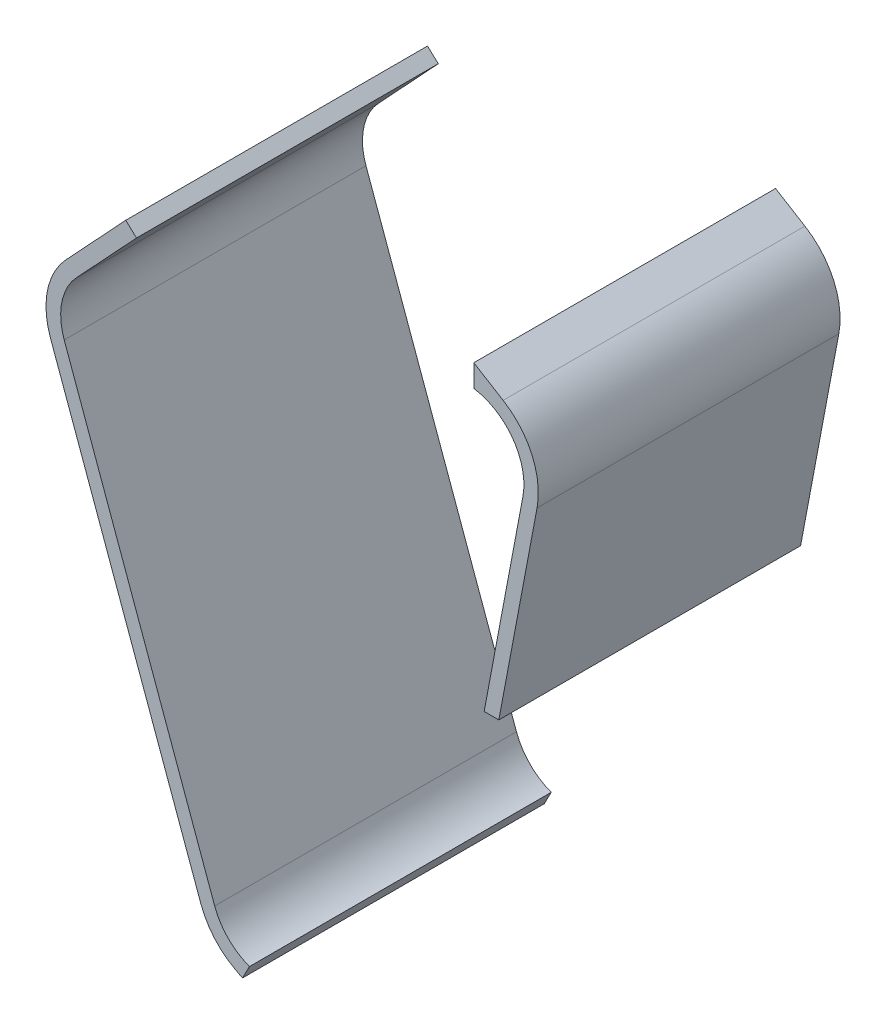
ISO-10303-21;
HEADER;
FILE_DESCRIPTION(('STEP AP214'),'2;1');
FILE_NAME('part.step','',(''),(''),'','','');
FILE_SCHEMA(('AUTOMOTIVE_DESIGN { 1 0 10303 214 1 1 1 1 }'));
ENDSEC;
DATA;
#1=APPLICATION_CONTEXT('core data for automotive mechanical design processes');
#2=APPLICATION_PROTOCOL_DEFINITION('international standard','automotive_design',2000,#1);
#3=PRODUCT_CONTEXT('',#1,'mechanical');
#4=PRODUCT('Part','Part','',(#3));
#5=PRODUCT_RELATED_PRODUCT_CATEGORY('part','',(#4));
#6=PRODUCT_DEFINITION_FORMATION('','',#4);
#7=PRODUCT_DEFINITION_CONTEXT('part definition',#1,'design');
#8=PRODUCT_DEFINITION('design','',#6,#7);
#9=PRODUCT_DEFINITION_SHAPE('','',#8);
#10=(LENGTH_UNIT() NAMED_UNIT(*) SI_UNIT(.MILLI.,.METRE.));
#11=(NAMED_UNIT(*) PLANE_ANGLE_UNIT() SI_UNIT($,.RADIAN.));
#12=(NAMED_UNIT(*) SI_UNIT($,.STERADIAN.) SOLID_ANGLE_UNIT());
#13=UNCERTAINTY_MEASURE_WITH_UNIT(LENGTH_MEASURE(1.E-05),#10,'distance_accuracy_value','');
#14=(GEOMETRIC_REPRESENTATION_CONTEXT(3) GLOBAL_UNCERTAINTY_ASSIGNED_CONTEXT((#13)) GLOBAL_UNIT_ASSIGNED_CONTEXT((#10,
#11,#12)) REPRESENTATION_CONTEXT('',''));
#15=CARTESIAN_POINT('',(0.,0.,0.));
#16=DIRECTION('',(0.,0.,1.));
#17=DIRECTION('',(1.,0.,0.));
#18=AXIS2_PLACEMENT_3D('',#15,#16,#17);
#19=CARTESIAN_POINT('',(1.00450592374361,185.32670057142,205.6));
#20=DIRECTION('',(-0.982679527718927,0.185313102078905,0.));
#21=DIRECTION('',(-0.185313102078905,-0.982679527718927,0.));
#22=AXIS2_PLACEMENT_3D('',#19,#20,#21);
#23=PLANE('',#22);
#24=DIRECTION('',(0.185313102078905,0.982679527718927,0.));
#25=VECTOR('',#24,1.);
#26=CARTESIAN_POINT('',(1.00450592374361,185.32670057142,0.));
#27=LINE('',#26,#25);
#28=CARTESIAN_POINT('',(1.00450592374361,185.32670057142,0.));
#29=VERTEX_POINT('',#28);
#30=CARTESIAN_POINT('',(27.0434246895327,323.406049025595,0.));
#31=VERTEX_POINT('',#30);
#32=EDGE_CURVE('E135',#29,#31,#27,.T.);
#33=ORIENTED_EDGE('',*,*,#32,.T.);
#34=DIRECTION('',(0.,0.,-1.));
#35=VECTOR('',#34,1.);
#36=CARTESIAN_POINT('',(27.0434246895327,323.406049025595,205.6));
#37=LINE('',#36,#35);
#38=CARTESIAN_POINT('',(27.0434246895327,323.406049025595,205.6));
#39=VERTEX_POINT('',#38);
#40=EDGE_CURVE('E12',#39,#31,#37,.T.);
#41=ORIENTED_EDGE('',*,*,#40,.F.);
#42=DIRECTION('',(0.185313102078905,0.982679527718927,0.));
#43=VECTOR('',#42,1.);
#44=CARTESIAN_POINT('',(1.00450592374361,185.32670057142,205.6));
#45=LINE('',#44,#43);
#46=CARTESIAN_POINT('',(1.00450592374361,185.32670057142,205.6));
#47=VERTEX_POINT('',#46);
#48=EDGE_CURVE('E147',#47,#39,#45,.T.);
#49=ORIENTED_EDGE('',*,*,#48,.F.);
#50=DIRECTION('',(0.,0.,-1.));
#51=VECTOR('',#50,1.);
#52=CARTESIAN_POINT('',(1.00450592374361,185.32670057142,205.6));
#53=LINE('',#52,#51);
#54=EDGE_CURVE('E131',#47,#29,#53,.T.);
#55=ORIENTED_EDGE('',*,*,#54,.T.);
#56=EDGE_LOOP('',(#33,#41,#49,#55));
#57=FACE_BOUND('',#56,.T.);
#58=ADVANCED_FACE('F45',(#57),#23,.F.);
#59=CARTESIAN_POINT('',(-22.0905516964136,332.67170412954,205.6));
#60=DIRECTION('',(0.,0.,-1.));
#61=DIRECTION('',(-1.,0.,0.));
#62=AXIS2_PLACEMENT_3D('',#59,#60,#61);
#63=CYLINDRICAL_SURFACE('',#62,50.);
#64=CARTESIAN_POINT('',(-22.0905516964136,332.67170412954,0.));
#65=DIRECTION('',(0.,0.,1.));
#66=DIRECTION('',(1.,0.,0.));
#67=AXIS2_PLACEMENT_3D('',#64,#65,#66);
#68=CIRCLE('',#67,50.);
#69=CARTESIAN_POINT('',(3.93982224508008,375.361511255668,0.));
#70=VERTEX_POINT('',#69);
#71=EDGE_CURVE('E138',#31,#70,#68,.T.);
#72=ORIENTED_EDGE('',*,*,#71,.T.);
#73=DIRECTION('',(0.,0.,-1.));
#74=VECTOR('',#73,1.);
#75=CARTESIAN_POINT('',(3.93982224508008,375.361511255668,205.6));
#76=LINE('',#75,#74);
#77=CARTESIAN_POINT('',(3.93982224508008,375.361511255668,205.6));
#78=VERTEX_POINT('',#77);
#79=EDGE_CURVE('E53',#78,#70,#76,.T.);
#80=ORIENTED_EDGE('',*,*,#79,.F.);
#81=CARTESIAN_POINT('',(-22.0905516964136,332.67170412954,205.6));
#82=DIRECTION('',(0.,0.,1.));
#83=DIRECTION('',(1.,0.,0.));
#84=AXIS2_PLACEMENT_3D('',#81,#82,#83);
#85=CIRCLE('',#84,50.);
#86=EDGE_CURVE('E101',#39,#78,#85,.T.);
#87=ORIENTED_EDGE('',*,*,#86,.F.);
#88=ORIENTED_EDGE('',*,*,#40,.T.);
#89=EDGE_LOOP('',(#72,#80,#87,#88));
#90=FACE_BOUND('',#89,.T.);
#91=ADVANCED_FACE('F172',(#90),#63,.T.);
#92=CARTESIAN_POINT('',(3.93982224508008,375.361511255668,205.6));
#93=DIRECTION('',(-0.520607478829875,-0.853796142522558,0.));
#94=DIRECTION('',(0.853796142522558,-0.520607478829876,0.));
#95=AXIS2_PLACEMENT_3D('',#92,#93,#94);
#96=PLANE('',#95);
#97=DIRECTION('',(-0.853796142522558,0.520607478829876,0.));
#98=VECTOR('',#97,1.);
#99=CARTESIAN_POINT('',(3.93982224508008,375.361511255668,0.));
#100=LINE('',#99,#98);
#101=CARTESIAN_POINT('',(-16.0601777549199,387.556634960297,0.));
#102=VERTEX_POINT('',#101);
#103=EDGE_CURVE('E140',#70,#102,#100,.T.);
#104=ORIENTED_EDGE('',*,*,#103,.T.);
#105=DIRECTION('',(0.,0.,-1.));
#106=VECTOR('',#105,1.);
#107=CARTESIAN_POINT('',(-16.0601777549199,387.556634960297,205.6));
#108=LINE('',#107,#106);
#109=CARTESIAN_POINT('',(-16.0601777549199,387.556634960297,205.6));
#110=VERTEX_POINT('',#109);
#111=EDGE_CURVE('E151',#110,#102,#108,.T.);
#112=ORIENTED_EDGE('',*,*,#111,.F.);
#113=DIRECTION('',(-0.853796142522558,0.520607478829876,0.));
#114=VECTOR('',#113,1.);
#115=CARTESIAN_POINT('',(3.93982224508008,375.361511255668,205.6));
#116=LINE('',#115,#114);
#117=EDGE_CURVE('E159',#78,#110,#116,.T.);
#118=ORIENTED_EDGE('',*,*,#117,.F.);
#119=ORIENTED_EDGE('',*,*,#79,.T.);
#120=EDGE_LOOP('',(#104,#112,#118,#119));
#121=FACE_BOUND('',#120,.T.);
#122=ADVANCED_FACE('F157',(#121),#96,.F.);
#123=CARTESIAN_POINT('',(-16.0601777549199,372.389722305509,205.6));
#124=DIRECTION('',(1.,0.,0.));
#125=DIRECTION('',(0.,1.,0.));
#126=AXIS2_PLACEMENT_3D('',#123,#124,#125);
#127=PLANE('',#126);
#128=DIRECTION('',(0.,-1.,0.));
#129=VECTOR('',#128,1.);
#130=CARTESIAN_POINT('',(-16.0601777549199,372.389722305509,0.));
#131=LINE('',#130,#129);
#132=CARTESIAN_POINT('',(-16.0601777549199,372.389722305509,0.));
#133=VERTEX_POINT('',#132);
#134=EDGE_CURVE('E142',#102,#133,#131,.T.);
#135=ORIENTED_EDGE('',*,*,#134,.T.);
#136=DIRECTION('',(0.,0.,-1.));
#137=VECTOR('',#136,1.);
#138=CARTESIAN_POINT('',(-16.0601777549199,372.389722305509,205.6));
#139=LINE('',#138,#137);
#140=CARTESIAN_POINT('',(-16.0601777549199,372.389722305509,205.6));
#141=VERTEX_POINT('',#140);
#142=EDGE_CURVE('E126',#141,#133,#139,.T.);
#143=ORIENTED_EDGE('',*,*,#142,.F.);
#144=DIRECTION('',(0.,-1.,0.));
#145=VECTOR('',#144,1.);
#146=CARTESIAN_POINT('',(-16.0601777549199,372.389722305509,205.6));
#147=LINE('',#146,#145);
#148=EDGE_CURVE('E117',#110,#141,#147,.T.);
#149=ORIENTED_EDGE('',*,*,#148,.F.);
#150=ORIENTED_EDGE('',*,*,#111,.T.);
#151=EDGE_LOOP('',(#135,#143,#149,#150));
#152=FACE_BOUND('',#151,.T.);
#153=ADVANCED_FACE('F165',(#152),#127,.F.);
#154=CARTESIAN_POINT('',(-22.0905516964136,332.67170412954,205.6));
#155=DIRECTION('',(0.,0.,-1.));
#156=DIRECTION('',(-1.,0.,0.));
#157=AXIS2_PLACEMENT_3D('',#154,#155,#156);
#158=CYLINDRICAL_SURFACE('',#157,40.1732047228107);
#159=CARTESIAN_POINT('',(-22.0905516964136,332.67170412954,0.));
#160=DIRECTION('',(0.,0.,-1.));
#161=DIRECTION('',(1.,0.,0.));
#162=AXIS2_PLACEMENT_3D('',#159,#160,#161);
#163=CIRCLE('',#162,40.1732047228107);
#164=CARTESIAN_POINT('',(17.3868341475538,325.227082941905,0.));
#165=VERTEX_POINT('',#164);
#166=EDGE_CURVE('E125',#133,#165,#163,.T.);
#167=ORIENTED_EDGE('',*,*,#166,.T.);
#168=DIRECTION('',(0.,0.,-1.));
#169=VECTOR('',#168,1.);
#170=CARTESIAN_POINT('',(17.3868341475538,325.227082941905,205.6));
#171=LINE('',#170,#169);
#172=CARTESIAN_POINT('',(17.3868341475538,325.227082941905,205.6));
#173=VERTEX_POINT('',#172);
#174=EDGE_CURVE('E122',#173,#165,#171,.T.);
#175=ORIENTED_EDGE('',*,*,#174,.F.);
#176=CARTESIAN_POINT('',(-22.0905516964136,332.67170412954,205.6));
#177=DIRECTION('',(0.,0.,-1.));
#178=DIRECTION('',(1.,0.,0.));
#179=AXIS2_PLACEMENT_3D('',#176,#177,#178);
#180=CIRCLE('',#179,40.1732047228107);
#181=EDGE_CURVE('E111',#141,#173,#180,.T.);
#182=ORIENTED_EDGE('',*,*,#181,.F.);
#183=ORIENTED_EDGE('',*,*,#142,.T.);
#184=EDGE_LOOP('',(#167,#175,#182,#183));
#185=FACE_BOUND('',#184,.T.);
#186=ADVANCED_FACE('F123',(#185),#158,.F.);
#187=CARTESIAN_POINT('',(-8.99549407625641,185.32670057142,205.6));
#188=DIRECTION('',(0.982679527718927,-0.185313102078906,0.));
#189=DIRECTION('',(0.185313102078906,0.982679527718927,0.));
#190=AXIS2_PLACEMENT_3D('',#187,#188,#189);
#191=PLANE('',#190);
#192=DIRECTION('',(-0.185313102078906,-0.982679527718927,0.));
#193=VECTOR('',#192,1.);
#194=CARTESIAN_POINT('',(-8.99549407625641,185.32670057142,0.));
#195=LINE('',#194,#193);
#196=CARTESIAN_POINT('',(-8.99549407625641,185.32670057142,0.));
#197=VERTEX_POINT('',#196);
#198=EDGE_CURVE('E87',#165,#197,#195,.T.);
#199=ORIENTED_EDGE('',*,*,#198,.T.);
#200=DIRECTION('',(0.,0.,-1.));
#201=VECTOR('',#200,1.);
#202=CARTESIAN_POINT('',(-8.99549407625641,185.32670057142,205.6));
#203=LINE('',#202,#201);
#204=CARTESIAN_POINT('',(-8.99549407625641,185.32670057142,205.6));
#205=VERTEX_POINT('',#204);
#206=EDGE_CURVE('E127',#205,#197,#203,.T.);
#207=ORIENTED_EDGE('',*,*,#206,.F.);
#208=DIRECTION('',(-0.185313102078906,-0.982679527718927,0.));
#209=VECTOR('',#208,1.);
#210=CARTESIAN_POINT('',(-8.99549407625641,185.32670057142,205.6));
#211=LINE('',#210,#209);
#212=EDGE_CURVE('E115',#173,#205,#211,.T.);
#213=ORIENTED_EDGE('',*,*,#212,.F.);
#214=ORIENTED_EDGE('',*,*,#174,.T.);
#215=EDGE_LOOP('',(#199,#207,#213,#214));
#216=FACE_BOUND('',#215,.T.);
#217=ADVANCED_FACE('F129',(#216),#191,.F.);
#218=CARTESIAN_POINT('',(-8.99549407625641,185.32670057142,205.6));
#219=DIRECTION('',(0.,1.,0.));
#220=DIRECTION('',(0.,0.,1.));
#221=AXIS2_PLACEMENT_3D('',#218,#219,#220);
#222=PLANE('',#221);
#223=DIRECTION('',(1.,0.,0.));
#224=VECTOR('',#223,1.);
#225=CARTESIAN_POINT('',(-8.99549407625641,185.32670057142,0.));
#226=LINE('',#225,#224);
#227=EDGE_CURVE('E93',#197,#29,#226,.T.);
#228=ORIENTED_EDGE('',*,*,#227,.T.);
#229=ORIENTED_EDGE('',*,*,#54,.F.);
#230=DIRECTION('',(1.,0.,0.));
#231=VECTOR('',#230,1.);
#232=CARTESIAN_POINT('',(-8.99549407625641,185.32670057142,205.6));
#233=LINE('',#232,#231);
#234=EDGE_CURVE('E61',#205,#47,#233,.T.);
#235=ORIENTED_EDGE('',*,*,#234,.F.);
#236=ORIENTED_EDGE('',*,*,#206,.T.);
#237=EDGE_LOOP('',(#228,#229,#235,#236));
#238=FACE_BOUND('',#237,.T.);
#239=ADVANCED_FACE('F186',(#238),#222,.F.);
#240=CARTESIAN_POINT('',(-22.0905516964136,332.67170412954,205.6));
#241=DIRECTION('',(0.,0.,1.));
#242=DIRECTION('',(1.,0.,0.));
#243=AXIS2_PLACEMENT_3D('',#240,#241,#242);
#244=PLANE('',#243);
#245=ORIENTED_EDGE('',*,*,#48,.T.);
#246=ORIENTED_EDGE('',*,*,#86,.T.);
#247=ORIENTED_EDGE('',*,*,#117,.T.);
#248=ORIENTED_EDGE('',*,*,#148,.T.);
#249=ORIENTED_EDGE('',*,*,#181,.T.);
#250=ORIENTED_EDGE('',*,*,#212,.T.);
#251=ORIENTED_EDGE('',*,*,#234,.T.);
#252=EDGE_LOOP('',(#245,#246,#247,#248,#249,#250,#251));
#253=FACE_BOUND('',#252,.T.);
#254=ADVANCED_FACE('F113',(#253),#244,.T.);
#255=CARTESIAN_POINT('',(-22.0905516964136,332.67170412954,0.));
#256=DIRECTION('',(0.,0.,1.));
#257=DIRECTION('',(1.,0.,0.));
#258=AXIS2_PLACEMENT_3D('',#255,#256,#257);
#259=PLANE('',#258);
#260=ORIENTED_EDGE('',*,*,#32,.F.);
#261=ORIENTED_EDGE('',*,*,#227,.F.);
#262=ORIENTED_EDGE('',*,*,#198,.F.);
#263=ORIENTED_EDGE('',*,*,#166,.F.);
#264=ORIENTED_EDGE('',*,*,#134,.F.);
#265=ORIENTED_EDGE('',*,*,#103,.F.);
#266=ORIENTED_EDGE('',*,*,#71,.F.);
#267=EDGE_LOOP('',(#260,#261,#262,#263,#264,#265,#266));
#268=FACE_BOUND('',#267,.T.);
#269=ADVANCED_FACE('F163',(#268),#259,.F.);
#270=CLOSED_SHELL('',(#58,#91,#122,#153,#186,#217,#239,#254,#269));
#271=MANIFOLD_SOLID_BREP('B2',#270);
#272=CARTESIAN_POINT('',(-178.073768212147,-51.9566293360056,205.6));
#273=DIRECTION('',(0.461604802751188,0.887085681361748,0.));
#274=DIRECTION('',(-0.887085681361748,0.461604802751188,0.));
#275=AXIS2_PLACEMENT_3D('',#272,#273,#274);
#276=PLANE('',#275);
#277=DIRECTION('',(0.887085681361748,-0.461604802751187,0.));
#278=VECTOR('',#277,1.);
#279=CARTESIAN_POINT('',(-178.073768212147,-51.9566293360056,0.));
#280=LINE('',#279,#278);
#281=CARTESIAN_POINT('',(-178.073768212147,-51.9566293360056,0.));
#282=VERTEX_POINT('',#281);
#283=CARTESIAN_POINT('',(-173.638339805338,-54.2646533497616,0.));
#284=VERTEX_POINT('',#283);
#285=EDGE_CURVE('E361',#282,#284,#280,.T.);
#286=ORIENTED_EDGE('',*,*,#285,.T.);
#287=DIRECTION('',(0.,0.,-1.));
#288=VECTOR('',#287,1.);
#289=CARTESIAN_POINT('',(-173.638339805338,-54.2646533497616,205.6));
#290=LINE('',#289,#288);
#291=CARTESIAN_POINT('',(-173.638339805338,-54.2646533497616,205.6));
#292=VERTEX_POINT('',#291);
#293=EDGE_CURVE('E43',#292,#284,#290,.T.);
#294=ORIENTED_EDGE('',*,*,#293,.F.);
#295=DIRECTION('',(0.887085681361748,-0.461604802751187,0.));
#296=VECTOR('',#295,1.);
#297=CARTESIAN_POINT('',(-178.073768212147,-51.9566293360056,205.6));
#298=LINE('',#297,#296);
#299=CARTESIAN_POINT('',(-178.073768212147,-51.9566293360056,205.6));
#300=VERTEX_POINT('',#299);
#301=EDGE_CURVE('E381',#300,#292,#298,.T.);
#302=ORIENTED_EDGE('',*,*,#301,.F.);
#303=DIRECTION('',(0.,0.,-1.));
#304=VECTOR('',#303,1.);
#305=CARTESIAN_POINT('',(-178.073768212147,-51.9566293360056,205.6));
#306=LINE('',#305,#304);
#307=EDGE_CURVE('E357',#300,#282,#306,.T.);
#308=ORIENTED_EDGE('',*,*,#307,.T.);
#309=EDGE_LOOP('',(#286,#294,#302,#308));
#310=FACE_BOUND('',#309,.T.);
#311=ADVANCED_FACE('F247',(#310),#276,.F.);
#312=CARTESIAN_POINT('',(-173.638339805338,-54.2646533497616,205.6));
#313=DIRECTION('',(-0.887085681361748,0.461604802751187,0.));
#314=DIRECTION('',(-0.461604802751188,-0.887085681361748,0.));
#315=AXIS2_PLACEMENT_3D('',#312,#313,#314);
#316=PLANE('',#315);
#317=DIRECTION('',(0.461604802751187,0.887085681361748,0.));
#318=VECTOR('',#317,1.);
#319=CARTESIAN_POINT('',(-173.638339805338,-54.2646533497616,0.));
#320=LINE('',#319,#318);
#321=CARTESIAN_POINT('',(-168.877472348868,-45.1154908490162,0.));
#322=VERTEX_POINT('',#321);
#323=EDGE_CURVE('E364',#284,#322,#320,.T.);
#324=ORIENTED_EDGE('',*,*,#323,.T.);
#325=DIRECTION('',(0.,0.,-1.));
#326=VECTOR('',#325,1.);
#327=CARTESIAN_POINT('',(-168.877472348868,-45.1154908490162,205.6));
#328=LINE('',#327,#326);
#329=CARTESIAN_POINT('',(-168.877472348868,-45.1154908490162,205.6));
#330=VERTEX_POINT('',#329);
#331=EDGE_CURVE('E255',#330,#322,#328,.T.);
#332=ORIENTED_EDGE('',*,*,#331,.F.);
#333=DIRECTION('',(0.461604802751187,0.887085681361748,0.));
#334=VECTOR('',#333,1.);
#335=CARTESIAN_POINT('',(-173.638339805338,-54.2646533497616,205.6));
#336=LINE('',#335,#334);
#337=EDGE_CURVE('E315',#292,#330,#336,.T.);
#338=ORIENTED_EDGE('',*,*,#337,.F.);
#339=ORIENTED_EDGE('',*,*,#293,.T.);
#340=EDGE_LOOP('',(#324,#332,#338,#339));
#341=FACE_BOUND('',#340,.T.);
#342=ADVANCED_FACE('F453',(#341),#316,.F.);
#343=CARTESIAN_POINT('',(-154.993528074587,-7.6023452679182,205.6));
#344=DIRECTION('',(0.,0.,-1.));
#345=DIRECTION('',(-1.,0.,0.));
#346=AXIS2_PLACEMENT_3D('',#343,#344,#345);
#347=CYLINDRICAL_SURFACE('',#346,40.);
#348=CARTESIAN_POINT('',(-154.993528074587,-7.6023452679182,0.));
#349=DIRECTION('',(0.,0.,-1.));
#350=DIRECTION('',(1.,0.,0.));
#351=AXIS2_PLACEMENT_3D('',#348,#349,#350);
#352=CIRCLE('',#351,40.);
#353=CARTESIAN_POINT('',(-192.597121358955,-21.2394187114352,0.));
#354=VERTEX_POINT('',#353);
#355=EDGE_CURVE('E366',#322,#354,#352,.T.);
#356=ORIENTED_EDGE('',*,*,#355,.T.);
#357=DIRECTION('',(0.,0.,-1.));
#358=VECTOR('',#357,1.);
#359=CARTESIAN_POINT('',(-192.597121358955,-21.2394187114352,205.6));
#360=LINE('',#359,#358);
#361=CARTESIAN_POINT('',(-192.597121358955,-21.2394187114352,205.6));
#362=VERTEX_POINT('',#361);
#363=EDGE_CURVE('E397',#362,#354,#360,.T.);
#364=ORIENTED_EDGE('',*,*,#363,.F.);
#365=CARTESIAN_POINT('',(-154.993528074587,-7.6023452679182,205.6));
#366=DIRECTION('',(0.,0.,-1.));
#367=DIRECTION('',(1.,0.,0.));
#368=AXIS2_PLACEMENT_3D('',#365,#366,#367);
#369=CIRCLE('',#368,40.);
#370=EDGE_CURVE('E405',#330,#362,#369,.T.);
#371=ORIENTED_EDGE('',*,*,#370,.F.);
#372=ORIENTED_EDGE('',*,*,#331,.T.);
#373=EDGE_LOOP('',(#356,#364,#371,#372));
#374=FACE_BOUND('',#373,.T.);
#375=ADVANCED_FACE('F403',(#374),#347,.F.);
#376=CARTESIAN_POINT('',(-192.597121358955,-21.2394187114352,205.6));
#377=DIRECTION('',(-0.940089832109185,-0.340926836087926,0.));
#378=DIRECTION('',(0.340926836087926,-0.940089832109185,0.));
#379=AXIS2_PLACEMENT_3D('',#376,#377,#378);
#380=PLANE('',#379);
#381=DIRECTION('',(-0.340926836087926,0.940089832109185,0.));
#382=VECTOR('',#381,1.);
#383=CARTESIAN_POINT('',(-192.597121358955,-21.2394187114352,0.));
#384=LINE('',#383,#382);
#385=CARTESIAN_POINT('',(-295.118607687298,261.45879295161,0.));
#386=VERTEX_POINT('',#385);
#387=EDGE_CURVE('E368',#354,#386,#384,.T.);
#388=ORIENTED_EDGE('',*,*,#387,.T.);
#389=DIRECTION('',(0.,0.,-1.));
#390=VECTOR('',#389,1.);
#391=CARTESIAN_POINT('',(-295.118607687298,261.45879295161,205.6));
#392=LINE('',#391,#390);
#393=CARTESIAN_POINT('',(-295.118607687298,261.45879295161,205.6));
#394=VERTEX_POINT('',#393);
#395=EDGE_CURVE('E394',#394,#386,#392,.T.);
#396=ORIENTED_EDGE('',*,*,#395,.F.);
#397=DIRECTION('',(-0.340926836087926,0.940089832109185,0.));
#398=VECTOR('',#397,1.);
#399=CARTESIAN_POINT('',(-192.597121358955,-21.2394187114352,205.6));
#400=LINE('',#399,#398);
#401=EDGE_CURVE('E423',#362,#394,#400,.T.);
#402=ORIENTED_EDGE('',*,*,#401,.F.);
#403=ORIENTED_EDGE('',*,*,#363,.T.);
#404=EDGE_LOOP('',(#388,#396,#402,#403));
#405=FACE_BOUND('',#404,.T.);
#406=ADVANCED_FACE('F414',(#405),#380,.F.);
#407=CARTESIAN_POINT('',(-257.515014402931,275.095866395127,205.6));
#408=DIRECTION('',(0.,0.,-1.));
#409=DIRECTION('',(-1.,0.,0.));
#410=AXIS2_PLACEMENT_3D('',#407,#408,#409);
#411=CYLINDRICAL_SURFACE('',#410,40.);
#412=CARTESIAN_POINT('',(-257.515014402931,275.095866395127,0.));
#413=DIRECTION('',(0.,0.,-1.));
#414=DIRECTION('',(1.,0.,0.));
#415=AXIS2_PLACEMENT_3D('',#412,#413,#414);
#416=CIRCLE('',#415,40.);
#417=CARTESIAN_POINT('',(-286.77014101567,302.374751395665,0.));
#418=VERTEX_POINT('',#417);
#419=EDGE_CURVE('E370',#386,#418,#416,.T.);
#420=ORIENTED_EDGE('',*,*,#419,.T.);
#421=DIRECTION('',(0.,0.,-1.));
#422=VECTOR('',#421,1.);
#423=CARTESIAN_POINT('',(-286.77014101567,302.374751395665,205.6));
#424=LINE('',#423,#422);
#425=CARTESIAN_POINT('',(-286.77014101567,302.374751395665,205.6));
#426=VERTEX_POINT('',#425);
#427=EDGE_CURVE('E391',#426,#418,#424,.T.);
#428=ORIENTED_EDGE('',*,*,#427,.F.);
#429=CARTESIAN_POINT('',(-257.515014402931,275.095866395127,205.6));
#430=DIRECTION('',(0.,0.,-1.));
#431=DIRECTION('',(1.,0.,0.));
#432=AXIS2_PLACEMENT_3D('',#429,#430,#431);
#433=CIRCLE('',#432,40.);
#434=EDGE_CURVE('E420',#394,#426,#433,.T.);
#435=ORIENTED_EDGE('',*,*,#434,.F.);
#436=ORIENTED_EDGE('',*,*,#395,.T.);
#437=EDGE_LOOP('',(#420,#428,#435,#436));
#438=FACE_BOUND('',#437,.T.);
#439=ADVANCED_FACE('F418',(#438),#411,.F.);
#440=CARTESIAN_POINT('',(-286.77014101567,302.374751395665,205.6));
#441=DIRECTION('',(-0.731378165318474,0.681972125013466,0.));
#442=DIRECTION('',(-0.681972125013466,-0.731378165318474,0.));
#443=AXIS2_PLACEMENT_3D('',#440,#441,#442);
#444=PLANE('',#443);
#445=DIRECTION('',(0.681972125013466,0.731378165318474,0.));
#446=VECTOR('',#445,1.);
#447=CARTESIAN_POINT('',(-286.77014101567,302.374751395665,0.));
#448=LINE('',#447,#446);
#449=CARTESIAN_POINT('',(-245.851813514862,346.257441314774,0.));
#450=VERTEX_POINT('',#449);
#451=EDGE_CURVE('E372',#418,#450,#448,.T.);
#452=ORIENTED_EDGE('',*,*,#451,.T.);
#453=DIRECTION('',(0.,0.,-1.));
#454=VECTOR('',#453,1.);
#455=CARTESIAN_POINT('',(-245.851813514862,346.257441314774,205.6));
#456=LINE('',#455,#454);
#457=CARTESIAN_POINT('',(-245.851813514862,346.257441314774,205.6));
#458=VERTEX_POINT('',#457);
#459=EDGE_CURVE('E388',#458,#450,#456,.T.);
#460=ORIENTED_EDGE('',*,*,#459,.F.);
#461=DIRECTION('',(0.681972125013466,0.731378165318474,0.));
#462=VECTOR('',#461,1.);
#463=CARTESIAN_POINT('',(-286.77014101567,302.374751395665,205.6));
#464=LINE('',#463,#462);
#465=EDGE_CURVE('E422',#426,#458,#464,.T.);
#466=ORIENTED_EDGE('',*,*,#465,.F.);
#467=ORIENTED_EDGE('',*,*,#427,.T.);
#468=EDGE_LOOP('',(#452,#460,#466,#467));
#469=FACE_BOUND('',#468,.T.);
#470=ADVANCED_FACE('F466',(#469),#444,.F.);
#471=CARTESIAN_POINT('',(-245.851813514862,346.257441314774,205.6));
#472=DIRECTION('',(-0.681972125013464,-0.731378165318476,0.));
#473=DIRECTION('',(0.731378165318476,-0.681972125013465,0.));
#474=AXIS2_PLACEMENT_3D('',#471,#472,#473);
#475=PLANE('',#474);
#476=DIRECTION('',(-0.731378165318476,0.681972125013464,0.));
#477=VECTOR('',#476,1.);
#478=CARTESIAN_POINT('',(-245.851813514862,346.257441314774,0.));
#479=LINE('',#478,#477);
#480=CARTESIAN_POINT('',(-253.165595168047,353.077162564908,0.));
#481=VERTEX_POINT('',#480);
#482=EDGE_CURVE('E374',#450,#481,#479,.T.);
#483=ORIENTED_EDGE('',*,*,#482,.T.);
#484=DIRECTION('',(0.,0.,-1.));
#485=VECTOR('',#484,1.);
#486=CARTESIAN_POINT('',(-253.165595168047,353.077162564908,205.6));
#487=LINE('',#486,#485);
#488=CARTESIAN_POINT('',(-253.165595168047,353.077162564908,205.6));
#489=VERTEX_POINT('',#488);
#490=EDGE_CURVE('E385',#489,#481,#487,.T.);
#491=ORIENTED_EDGE('',*,*,#490,.F.);
#492=DIRECTION('',(-0.731378165318476,0.681972125013464,0.));
#493=VECTOR('',#492,1.);
#494=CARTESIAN_POINT('',(-245.851813514862,346.257441314774,205.6));
#495=LINE('',#494,#493);
#496=EDGE_CURVE('E425',#458,#489,#495,.T.);
#497=ORIENTED_EDGE('',*,*,#496,.F.);
#498=ORIENTED_EDGE('',*,*,#459,.T.);
#499=EDGE_LOOP('',(#483,#491,#497,#498));
#500=FACE_BOUND('',#499,.T.);
#501=ADVANCED_FACE('F434',(#500),#475,.F.);
#502=CARTESIAN_POINT('',(-253.165595168047,353.077162564908,205.6));
#503=DIRECTION('',(0.731378165318474,-0.681972125013466,0.));
#504=DIRECTION('',(0.681972125013466,0.731378165318474,0.));
#505=AXIS2_PLACEMENT_3D('',#502,#503,#504);
#506=PLANE('',#505);
#507=DIRECTION('',(-0.681972125013466,-0.731378165318474,0.));
#508=VECTOR('',#507,1.);
#509=CARTESIAN_POINT('',(-253.165595168047,353.077162564908,0.));
#510=LINE('',#509,#508);
#511=CARTESIAN_POINT('',(-294.083922668855,309.1944726458,0.));
#512=VERTEX_POINT('',#511);
#513=EDGE_CURVE('E376',#481,#512,#510,.T.);
#514=ORIENTED_EDGE('',*,*,#513,.T.);
#515=DIRECTION('',(0.,0.,-1.));
#516=VECTOR('',#515,1.);
#517=CARTESIAN_POINT('',(-294.083922668855,309.1944726458,205.6));
#518=LINE('',#517,#516);
#519=CARTESIAN_POINT('',(-294.083922668855,309.1944726458,205.6));
#520=VERTEX_POINT('',#519);
#521=EDGE_CURVE('E352',#520,#512,#518,.T.);
#522=ORIENTED_EDGE('',*,*,#521,.F.);
#523=DIRECTION('',(-0.681972125013466,-0.731378165318474,0.));
#524=VECTOR('',#523,1.);
#525=CARTESIAN_POINT('',(-253.165595168047,353.077162564908,205.6));
#526=LINE('',#525,#524);
#527=EDGE_CURVE('E343',#489,#520,#526,.T.);
#528=ORIENTED_EDGE('',*,*,#527,.F.);
#529=ORIENTED_EDGE('',*,*,#490,.T.);
#530=EDGE_LOOP('',(#514,#522,#528,#529));
#531=FACE_BOUND('',#530,.T.);
#532=ADVANCED_FACE('F438',(#531),#506,.F.);
#533=CARTESIAN_POINT('',(-257.515014402931,275.095866395127,205.6));
#534=DIRECTION('',(0.,0.,-1.));
#535=DIRECTION('',(-1.,0.,0.));
#536=AXIS2_PLACEMENT_3D('',#533,#534,#535);
#537=CYLINDRICAL_SURFACE('',#536,50.);
#538=CARTESIAN_POINT('',(-257.515014402931,275.095866395127,0.));
#539=DIRECTION('',(0.,0.,1.));
#540=DIRECTION('',(1.,0.,0.));
#541=AXIS2_PLACEMENT_3D('',#538,#539,#540);
#542=CIRCLE('',#541,50.);
#543=CARTESIAN_POINT('',(-304.51950600839,258.04952459073,0.));
#544=VERTEX_POINT('',#543);
#545=EDGE_CURVE('E351',#512,#544,#542,.T.);
#546=ORIENTED_EDGE('',*,*,#545,.T.);
#547=DIRECTION('',(0.,0.,-1.));
#548=VECTOR('',#547,1.);
#549=CARTESIAN_POINT('',(-304.51950600839,258.04952459073,205.6));
#550=LINE('',#549,#548);
#551=CARTESIAN_POINT('',(-304.51950600839,258.04952459073,205.6));
#552=VERTEX_POINT('',#551);
#553=EDGE_CURVE('E348',#552,#544,#550,.T.);
#554=ORIENTED_EDGE('',*,*,#553,.F.);
#555=CARTESIAN_POINT('',(-257.515014402931,275.095866395127,205.6));
#556=DIRECTION('',(0.,0.,1.));
#557=DIRECTION('',(1.,0.,0.));
#558=AXIS2_PLACEMENT_3D('',#555,#556,#557);
#559=CIRCLE('',#558,50.);
#560=EDGE_CURVE('E337',#520,#552,#559,.T.);
#561=ORIENTED_EDGE('',*,*,#560,.F.);
#562=ORIENTED_EDGE('',*,*,#521,.T.);
#563=EDGE_LOOP('',(#546,#554,#561,#562));
#564=FACE_BOUND('',#563,.T.);
#565=ADVANCED_FACE('F349',(#564),#537,.T.);
#566=CARTESIAN_POINT('',(-304.51950600839,258.04952459073,205.6));
#567=DIRECTION('',(0.940089832109185,0.340926836087926,0.));
#568=DIRECTION('',(-0.340926836087926,0.940089832109186,0.));
#569=AXIS2_PLACEMENT_3D('',#566,#567,#568);
#570=PLANE('',#569);
#571=DIRECTION('',(0.340926836087926,-0.940089832109185,0.));
#572=VECTOR('',#571,1.);
#573=CARTESIAN_POINT('',(-304.51950600839,258.04952459073,0.));
#574=LINE('',#573,#572);
#575=CARTESIAN_POINT('',(-201.998019680047,-24.6486870723146,0.));
#576=VERTEX_POINT('',#575);
#577=EDGE_CURVE('E301',#544,#576,#574,.T.);
#578=ORIENTED_EDGE('',*,*,#577,.T.);
#579=DIRECTION('',(0.,0.,-1.));
#580=VECTOR('',#579,1.);
#581=CARTESIAN_POINT('',(-201.998019680047,-24.6486870723146,205.6));
#582=LINE('',#581,#580);
#583=CARTESIAN_POINT('',(-201.998019680047,-24.6486870723146,205.6));
#584=VERTEX_POINT('',#583);
#585=EDGE_CURVE('E353',#584,#576,#582,.T.);
#586=ORIENTED_EDGE('',*,*,#585,.F.);
#587=DIRECTION('',(0.340926836087926,-0.940089832109185,0.));
#588=VECTOR('',#587,1.);
#589=CARTESIAN_POINT('',(-304.51950600839,258.04952459073,205.6));
#590=LINE('',#589,#588);
#591=EDGE_CURVE('E341',#552,#584,#590,.T.);
#592=ORIENTED_EDGE('',*,*,#591,.F.);
#593=ORIENTED_EDGE('',*,*,#553,.T.);
#594=EDGE_LOOP('',(#578,#586,#592,#593));
#595=FACE_BOUND('',#594,.T.);
#596=ADVANCED_FACE('F355',(#595),#570,.F.);
#597=CARTESIAN_POINT('',(-154.993528074587,-7.6023452679182,205.6));
#598=DIRECTION('',(0.,0.,-1.));
#599=DIRECTION('',(-1.,0.,0.));
#600=AXIS2_PLACEMENT_3D('',#597,#598,#599);
#601=CYLINDRICAL_SURFACE('',#600,50.);
#602=CARTESIAN_POINT('',(-154.993528074587,-7.6023452679182,0.));
#603=DIRECTION('',(0.,0.,1.));
#604=DIRECTION('',(1.,0.,0.));
#605=AXIS2_PLACEMENT_3D('',#602,#603,#604);
#606=CIRCLE('',#605,50.);
#607=EDGE_CURVE('E307',#576,#282,#606,.T.);
#608=ORIENTED_EDGE('',*,*,#607,.T.);
#609=ORIENTED_EDGE('',*,*,#307,.F.);
#610=CARTESIAN_POINT('',(-154.993528074587,-7.6023452679182,205.6));
#611=DIRECTION('',(0.,0.,1.));
#612=DIRECTION('',(1.,0.,0.));
#613=AXIS2_PLACEMENT_3D('',#610,#611,#612);
#614=CIRCLE('',#613,50.);
#615=EDGE_CURVE('E263',#584,#300,#614,.T.);
#616=ORIENTED_EDGE('',*,*,#615,.F.);
#617=ORIENTED_EDGE('',*,*,#585,.T.);
#618=EDGE_LOOP('',(#608,#609,#616,#617));
#619=FACE_BOUND('',#618,.T.);
#620=ADVANCED_FACE('F442',(#619),#601,.T.);
#621=CARTESIAN_POINT('',(-154.993528074587,-7.6023452679182,205.6));
#622=DIRECTION('',(0.,0.,1.));
#623=DIRECTION('',(1.,0.,0.));
#624=AXIS2_PLACEMENT_3D('',#621,#622,#623);
#625=PLANE('',#624);
#626=ORIENTED_EDGE('',*,*,#301,.T.);
#627=ORIENTED_EDGE('',*,*,#337,.T.);
#628=ORIENTED_EDGE('',*,*,#370,.T.);
#629=ORIENTED_EDGE('',*,*,#401,.T.);
#630=ORIENTED_EDGE('',*,*,#434,.T.);
#631=ORIENTED_EDGE('',*,*,#465,.T.);
#632=ORIENTED_EDGE('',*,*,#496,.T.);
#633=ORIENTED_EDGE('',*,*,#527,.T.);
#634=ORIENTED_EDGE('',*,*,#560,.T.);
#635=ORIENTED_EDGE('',*,*,#591,.T.);
#636=ORIENTED_EDGE('',*,*,#615,.T.);
#637=EDGE_LOOP('',(#626,#627,#628,#629,#630,#631,#632,#633,#634,#635,#636));
#638=FACE_BOUND('',#637,.T.);
#639=ADVANCED_FACE('F339',(#638),#625,.T.);
#640=CARTESIAN_POINT('',(-154.993528074587,-7.6023452679182,0.));
#641=DIRECTION('',(0.,0.,1.));
#642=DIRECTION('',(1.,0.,0.));
#643=AXIS2_PLACEMENT_3D('',#640,#641,#642);
#644=PLANE('',#643);
#645=ORIENTED_EDGE('',*,*,#285,.F.);
#646=ORIENTED_EDGE('',*,*,#607,.F.);
#647=ORIENTED_EDGE('',*,*,#577,.F.);
#648=ORIENTED_EDGE('',*,*,#545,.F.);
#649=ORIENTED_EDGE('',*,*,#513,.F.);
#650=ORIENTED_EDGE('',*,*,#482,.F.);
#651=ORIENTED_EDGE('',*,*,#451,.F.);
#652=ORIENTED_EDGE('',*,*,#419,.F.);
#653=ORIENTED_EDGE('',*,*,#387,.F.);
#654=ORIENTED_EDGE('',*,*,#355,.F.);
#655=ORIENTED_EDGE('',*,*,#323,.F.);
#656=EDGE_LOOP('',(#645,#646,#647,#648,#649,#650,#651,#652,#653,#654,#655));
#657=FACE_BOUND('',#656,.T.);
#658=ADVANCED_FACE('F409',(#657),#644,.F.);
#659=CLOSED_SHELL('',(#311,#342,#375,#406,#439,#470,#501,#532,#565,#596,#620,#639,#658));
#660=MANIFOLD_SOLID_BREP('B6',#659);
#661=ADVANCED_BREP_SHAPE_REPRESENTATION('',(#18,#271,#660),#14);
#662=SHAPE_DEFINITION_REPRESENTATION(#9,#661);
ENDSEC;
END-ISO-10303-21;
